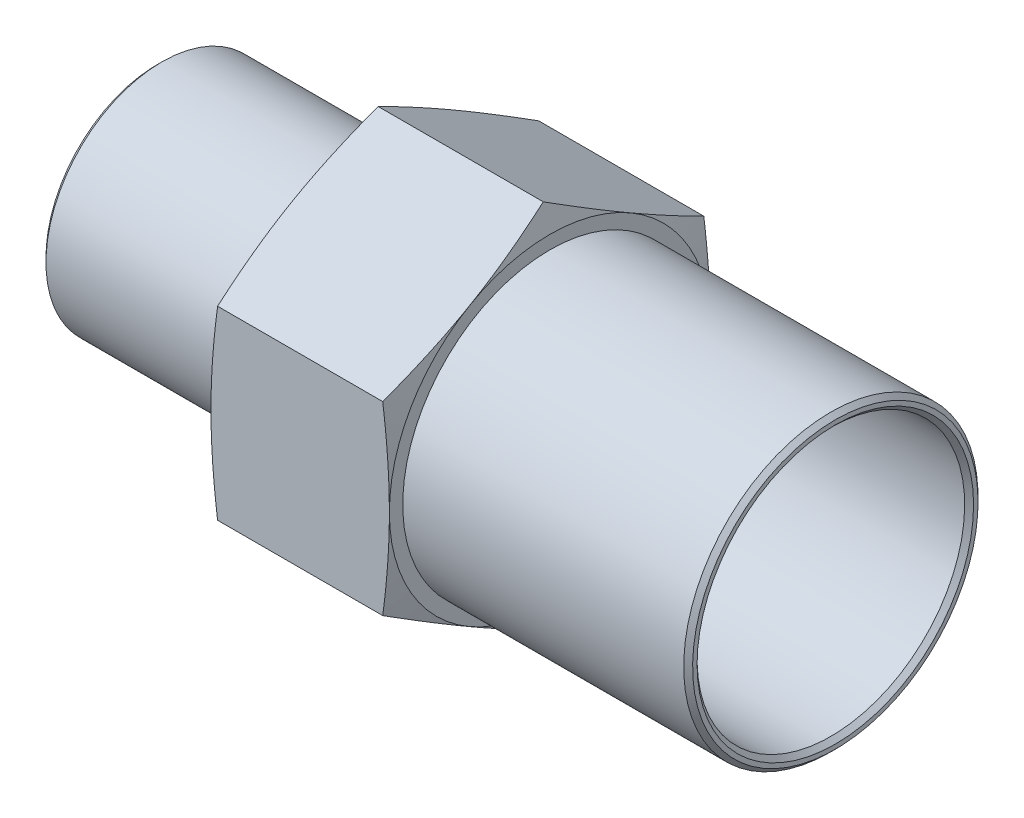
ISO-10303-21;
HEADER;
FILE_DESCRIPTION(('STEP AP214'),'2;1');
FILE_NAME('part.step','',(''),(''),'','','');
FILE_SCHEMA(('AUTOMOTIVE_DESIGN { 1 0 10303 214 1 1 1 1 }'));
ENDSEC;
DATA;
#1=APPLICATION_CONTEXT('core data for automotive mechanical design processes');
#2=APPLICATION_PROTOCOL_DEFINITION('international standard','automotive_design',2000,#1);
#3=PRODUCT_CONTEXT('',#1,'mechanical');
#4=PRODUCT('Part','Part','',(#3));
#5=PRODUCT_RELATED_PRODUCT_CATEGORY('part','',(#4));
#6=PRODUCT_DEFINITION_FORMATION('','',#4);
#7=PRODUCT_DEFINITION_CONTEXT('part definition',#1,'design');
#8=PRODUCT_DEFINITION('design','',#6,#7);
#9=PRODUCT_DEFINITION_SHAPE('','',#8);
#10=(LENGTH_UNIT() NAMED_UNIT(*) SI_UNIT(.MILLI.,.METRE.));
#11=(NAMED_UNIT(*) PLANE_ANGLE_UNIT() SI_UNIT($,.RADIAN.));
#12=(NAMED_UNIT(*) SI_UNIT($,.STERADIAN.) SOLID_ANGLE_UNIT());
#13=UNCERTAINTY_MEASURE_WITH_UNIT(LENGTH_MEASURE(1.E-05),#10,'distance_accuracy_value','');
#14=(GEOMETRIC_REPRESENTATION_CONTEXT(3) GLOBAL_UNCERTAINTY_ASSIGNED_CONTEXT((#13)) GLOBAL_UNIT_ASSIGNED_CONTEXT((#10,
#11,#12)) REPRESENTATION_CONTEXT('',''));
#15=CARTESIAN_POINT('',(0.,0.,0.));
#16=DIRECTION('',(0.,0.,1.));
#17=DIRECTION('',(1.,0.,0.));
#18=AXIS2_PLACEMENT_3D('',#15,#16,#17);
#19=CARTESIAN_POINT('',(22.35,0.,0.));
#20=DIRECTION('',(-1.,0.,0.));
#21=DIRECTION('',(0.,-1.,0.));
#22=AXIS2_PLACEMENT_3D('',#19,#20,#21);
#23=CYLINDRICAL_SURFACE('',#22,8.25);
#24=CARTESIAN_POINT('',(6.35,0.,0.));
#25=DIRECTION('',(1.,0.,0.));
#26=DIRECTION('',(0.,1.,0.));
#27=AXIS2_PLACEMENT_3D('',#24,#25,#26);
#28=CIRCLE('',#27,8.25);
#29=CARTESIAN_POINT('',(6.35,8.25,0.));
#30=VERTEX_POINT('',#29);
#31=EDGE_CURVE('E378',#30,#30,#28,.T.);
#32=ORIENTED_EDGE('',*,*,#31,.T.);
#33=EDGE_LOOP('',(#32));
#34=FACE_BOUND('',#33,.T.);
#35=CARTESIAN_POINT('',(22.1,0.,0.));
#36=DIRECTION('',(-1.,0.,0.));
#37=DIRECTION('',(0.,-1.,0.));
#38=AXIS2_PLACEMENT_3D('',#35,#36,#37);
#39=CIRCLE('',#38,8.25);
#40=CARTESIAN_POINT('',(22.1,-8.25,0.));
#41=VERTEX_POINT('',#40);
#42=EDGE_CURVE('E49',#41,#41,#39,.F.);
#43=ORIENTED_EDGE('',*,*,#42,.F.);
#44=EDGE_LOOP('',(#43));
#45=FACE_BOUND('',#44,.T.);
#46=ADVANCED_FACE('F45',(#34,#45),#23,.T.);
#47=CARTESIAN_POINT('',(-3.65,0.,0.));
#48=DIRECTION('',(-1.,0.,0.));
#49=DIRECTION('',(0.,-1.,0.));
#50=AXIS2_PLACEMENT_3D('',#47,#48,#49);
#51=CYLINDRICAL_SURFACE('',#50,6.5);
#52=CARTESIAN_POINT('',(-3.65,0.,0.));
#53=DIRECTION('',(-1.,0.,0.));
#54=DIRECTION('',(0.,-1.,0.));
#55=AXIS2_PLACEMENT_3D('',#52,#53,#54);
#56=CIRCLE('',#55,6.5);
#57=CARTESIAN_POINT('',(-3.65,-6.5,0.));
#58=VERTEX_POINT('',#57);
#59=EDGE_CURVE('E341',#58,#58,#56,.T.);
#60=ORIENTED_EDGE('',*,*,#59,.T.);
#61=EDGE_LOOP('',(#60));
#62=FACE_BOUND('',#61,.T.);
#63=CARTESIAN_POINT('',(-15.4,0.,0.));
#64=DIRECTION('',(1.,0.,0.));
#65=DIRECTION('',(0.,1.,0.));
#66=AXIS2_PLACEMENT_3D('',#63,#64,#65);
#67=CIRCLE('',#66,6.5);
#68=CARTESIAN_POINT('',(-15.4,6.5,0.));
#69=VERTEX_POINT('',#68);
#70=EDGE_CURVE('E330',#69,#69,#67,.T.);
#71=ORIENTED_EDGE('',*,*,#70,.T.);
#72=EDGE_LOOP('',(#71));
#73=FACE_BOUND('',#72,.T.);
#74=ADVANCED_FACE('F511',(#62,#73),#51,.T.);
#75=CARTESIAN_POINT('',(-3.65,-4.5,0.));
#76=DIRECTION('',(-1.,0.,0.));
#77=DIRECTION('',(0.,1.,0.));
#78=AXIS2_PLACEMENT_3D('',#75,#76,#77);
#79=PLANE('',#78);
#80=CARTESIAN_POINT('',(-3.65,0.,0.));
#81=DIRECTION('',(1.,0.,0.));
#82=DIRECTION('',(0.,-1.,0.));
#83=AXIS2_PLACEMENT_3D('',#80,#81,#82);
#84=CIRCLE('',#83,9.);
#85=CARTESIAN_POINT('',(-3.65,-7.79422863405995,4.5));
#86=VERTEX_POINT('',#85);
#87=CARTESIAN_POINT('',(-3.65,-7.79422863405995,-4.5));
#88=VERTEX_POINT('',#87);
#89=EDGE_CURVE('E298',#86,#88,#84,.T.);
#90=ORIENTED_EDGE('',*,*,#89,.F.);
#91=CARTESIAN_POINT('',(-3.65,0.,0.));
#92=DIRECTION('',(1.,0.,0.));
#93=DIRECTION('',(0.,-1.,0.));
#94=AXIS2_PLACEMENT_3D('',#91,#92,#93);
#95=CIRCLE('',#94,9.);
#96=CARTESIAN_POINT('',(-3.65,0.,9.));
#97=VERTEX_POINT('',#96);
#98=EDGE_CURVE('E235',#97,#86,#95,.T.);
#99=ORIENTED_EDGE('',*,*,#98,.F.);
#100=CARTESIAN_POINT('',(-3.65,0.,0.));
#101=DIRECTION('',(1.,0.,0.));
#102=DIRECTION('',(0.,-1.,0.));
#103=AXIS2_PLACEMENT_3D('',#100,#101,#102);
#104=CIRCLE('',#103,9.);
#105=CARTESIAN_POINT('',(-3.65,7.79422863405995,4.5));
#106=VERTEX_POINT('',#105);
#107=EDGE_CURVE('E227',#106,#97,#104,.T.);
#108=ORIENTED_EDGE('',*,*,#107,.F.);
#109=CARTESIAN_POINT('',(-3.65,0.,0.));
#110=DIRECTION('',(1.,0.,0.));
#111=DIRECTION('',(0.,-1.,0.));
#112=AXIS2_PLACEMENT_3D('',#109,#110,#111);
#113=CIRCLE('',#112,9.);
#114=CARTESIAN_POINT('',(-3.65,7.79422863405994,-4.5));
#115=VERTEX_POINT('',#114);
#116=EDGE_CURVE('E234',#115,#106,#113,.T.);
#117=ORIENTED_EDGE('',*,*,#116,.F.);
#118=CARTESIAN_POINT('',(-3.65,0.,0.));
#119=DIRECTION('',(1.,0.,0.));
#120=DIRECTION('',(0.,-1.,0.));
#121=AXIS2_PLACEMENT_3D('',#118,#119,#120);
#122=CIRCLE('',#121,9.);
#123=CARTESIAN_POINT('',(-3.65,0.,-9.));
#124=VERTEX_POINT('',#123);
#125=EDGE_CURVE('E208',#124,#115,#122,.T.);
#126=ORIENTED_EDGE('',*,*,#125,.F.);
#127=CARTESIAN_POINT('',(-3.65,0.,0.));
#128=DIRECTION('',(1.,0.,0.));
#129=DIRECTION('',(0.,-1.,0.));
#130=AXIS2_PLACEMENT_3D('',#127,#128,#129);
#131=CIRCLE('',#130,9.);
#132=EDGE_CURVE('E203',#88,#124,#131,.T.);
#133=ORIENTED_EDGE('',*,*,#132,.F.);
#134=EDGE_LOOP('',(#90,#99,#108,#117,#126,#133));
#135=FACE_BOUND('',#134,.T.);
#136=ORIENTED_EDGE('',*,*,#59,.F.);
#137=EDGE_LOOP('',(#136));
#138=FACE_BOUND('',#137,.T.);
#139=ADVANCED_FACE('F494',(#135,#138),#79,.T.);
#140=CARTESIAN_POINT('',(-4.65,-7.79422863405995,-4.5));
#141=DIRECTION('',(0.,-0.866025403784439,-0.5));
#142=DIRECTION('',(0.,0.5,-0.866025403784439));
#143=AXIS2_PLACEMENT_3D('',#140,#141,#142);
#144=PLANE('',#143);
#145=DIRECTION('',(1.,0.,0.));
#146=VECTOR('',#145,1.);
#147=CARTESIAN_POINT('',(-4.65,-5.19615242270663,-9.));
#148=LINE('',#147,#146);
#149=CARTESIAN_POINT('',(-3.27693304105358,-5.19615242270663,-9.));
#150=VERTEX_POINT('',#149);
#151=CARTESIAN_POINT('',(5.97693304105358,-5.19615242270663,-9.));
#152=VERTEX_POINT('',#151);
#153=EDGE_CURVE('E12',#150,#152,#148,.T.);
#154=ORIENTED_EDGE('',*,*,#153,.T.);
#155=CARTESIAN_POINT('',(5.97621087655858,-5.19345831548124,-9.00466633059542));
#156=CARTESIAN_POINT('',(6.35,-6.58737465792135,-6.59033240398856));
#157=CARTESIAN_POINT('',(6.35,-7.79422863405995,-4.5));
#158=CARTESIAN_POINT('',(6.35,-9.00108261019855,-2.40966759601143));
#159=CARTESIAN_POINT('',(5.97621087655858,-10.3949989526387,0.00466633059542202));
#160=(BOUNDED_CURVE() B_SPLINE_CURVE(2,(#155,#156,#157,#158,#159),.UNSPECIFIED.,.F.,
.F.) B_SPLINE_CURVE_WITH_KNOTS((3,2,3),(0.,5.21793533208069,10.4358706641614),
.UNSPECIFIED.) CURVE() GEOMETRIC_REPRESENTATION_ITEM() RATIONAL_B_SPLINE_CURVE((1.,
1.03802697460133,1.,1.03802697460135,1.)) REPRESENTATION_ITEM(''));
#161=CARTESIAN_POINT('',(6.35,-7.79422863405995,-4.5));
#162=VERTEX_POINT('',#161);
#163=EDGE_CURVE('E179',#152,#162,#160,.T.);
#164=ORIENTED_EDGE('',*,*,#163,.T.);
#165=CARTESIAN_POINT('',(5.97621087655858,-5.19345831548124,-9.00466633059542));
#166=CARTESIAN_POINT('',(6.35,-6.58737465792135,-6.59033240398856));
#167=CARTESIAN_POINT('',(6.35,-7.79422863405995,-4.5));
#168=CARTESIAN_POINT('',(6.35,-9.00108261019855,-2.40966759601143));
#169=CARTESIAN_POINT('',(5.97621087655858,-10.3949989526387,0.00466633059542202));
#170=(BOUNDED_CURVE() B_SPLINE_CURVE(2,(#165,#166,#167,#168,#169),.UNSPECIFIED.,.F.,
.F.) B_SPLINE_CURVE_WITH_KNOTS((3,2,3),(0.,5.21793533208069,10.4358706641614),
.UNSPECIFIED.) CURVE() GEOMETRIC_REPRESENTATION_ITEM() RATIONAL_B_SPLINE_CURVE((1.,
1.03802697460133,1.,1.03802697460135,1.)) REPRESENTATION_ITEM(''));
#171=CARTESIAN_POINT('',(5.97693304105358,-10.3923048454133,0.));
#172=VERTEX_POINT('',#171);
#173=EDGE_CURVE('E192',#162,#172,#170,.T.);
#174=ORIENTED_EDGE('',*,*,#173,.T.);
#175=DIRECTION('',(1.,0.,0.));
#176=VECTOR('',#175,1.);
#177=CARTESIAN_POINT('',(-4.65,-10.3923048454133,0.));
#178=LINE('',#177,#176);
#179=CARTESIAN_POINT('',(-3.27693304105358,-10.3923048454133,0.));
#180=VERTEX_POINT('',#179);
#181=EDGE_CURVE('E64',#180,#172,#178,.T.);
#182=ORIENTED_EDGE('',*,*,#181,.F.);
#183=CARTESIAN_POINT('',(-3.27621087655858,-5.19345831548124,-9.00466633059542));
#184=CARTESIAN_POINT('',(-3.65,-6.58737465792135,-6.59033240398856));
#185=CARTESIAN_POINT('',(-3.65,-7.79422863405995,-4.5));
#186=CARTESIAN_POINT('',(-3.65,-9.00108261019855,-2.40966759601143));
#187=CARTESIAN_POINT('',(-3.27621087655858,-10.3949989526387,0.00466633059542202));
#188=(BOUNDED_CURVE() B_SPLINE_CURVE(2,(#183,#184,#185,#186,#187),.UNSPECIFIED.,.F.,
.F.) B_SPLINE_CURVE_WITH_KNOTS((3,2,3),(0.,5.21793533208069,10.4358706641614),
.UNSPECIFIED.) CURVE() GEOMETRIC_REPRESENTATION_ITEM() RATIONAL_B_SPLINE_CURVE((1.,
1.03802697460133,1.,1.03802697460135,1.)) REPRESENTATION_ITEM(''));
#189=EDGE_CURVE('E97',#88,#180,#188,.T.);
#190=ORIENTED_EDGE('',*,*,#189,.F.);
#191=CARTESIAN_POINT('',(-3.27621087655858,-5.19345831548124,-9.00466633059542));
#192=CARTESIAN_POINT('',(-3.65,-6.58737465792135,-6.59033240398856));
#193=CARTESIAN_POINT('',(-3.65,-7.79422863405995,-4.5));
#194=CARTESIAN_POINT('',(-3.65,-9.00108261019855,-2.40966759601143));
#195=CARTESIAN_POINT('',(-3.27621087655858,-10.3949989526387,0.00466633059542202));
#196=(BOUNDED_CURVE() B_SPLINE_CURVE(2,(#191,#192,#193,#194,#195),.UNSPECIFIED.,.F.,
.F.) B_SPLINE_CURVE_WITH_KNOTS((3,2,3),(0.,5.21793533208069,10.4358706641614),
.UNSPECIFIED.) CURVE() GEOMETRIC_REPRESENTATION_ITEM() RATIONAL_B_SPLINE_CURVE((1.,
1.03802697460133,1.,1.03802697460135,1.)) REPRESENTATION_ITEM(''));
#197=EDGE_CURVE('E236',#150,#88,#196,.T.);
#198=ORIENTED_EDGE('',*,*,#197,.F.);
#199=EDGE_LOOP('',(#154,#164,#174,#182,#190,#198));
#200=FACE_BOUND('',#199,.T.);
#201=ADVANCED_FACE('F485',(#200),#144,.T.);
#202=CARTESIAN_POINT('',(-4.65,0.,-9.));
#203=DIRECTION('',(0.,0.,-1.));
#204=DIRECTION('',(0.,1.,0.));
#205=AXIS2_PLACEMENT_3D('',#202,#203,#204);
#206=PLANE('',#205);
#207=DIRECTION('',(1.,0.,0.));
#208=VECTOR('',#207,1.);
#209=CARTESIAN_POINT('',(-4.65,5.19615242270663,-9.));
#210=LINE('',#209,#208);
#211=CARTESIAN_POINT('',(-3.27693304105358,5.19615242270663,-9.));
#212=VERTEX_POINT('',#211);
#213=CARTESIAN_POINT('',(5.97693304105358,5.19615242270663,-9.));
#214=VERTEX_POINT('',#213);
#215=EDGE_CURVE('E56',#212,#214,#210,.T.);
#216=ORIENTED_EDGE('',*,*,#215,.T.);
#217=CARTESIAN_POINT('',(5.97621087655858,5.20154063715742,-9.));
#218=CARTESIAN_POINT('',(6.35,2.41370795227722,-9.));
#219=CARTESIAN_POINT('',(6.35,0.,-9.));
#220=CARTESIAN_POINT('',(6.35,-2.41370795227722,-9.));
#221=CARTESIAN_POINT('',(5.97621087655858,-5.20154063715742,-9.));
#222=(BOUNDED_CURVE() B_SPLINE_CURVE(2,(#217,#218,#219,#220,#221),.UNSPECIFIED.,.F.,
.F.) B_SPLINE_CURVE_WITH_KNOTS((3,2,3),(0.,5.21793533208069,10.4358706641614),
.UNSPECIFIED.) CURVE() GEOMETRIC_REPRESENTATION_ITEM() RATIONAL_B_SPLINE_CURVE((1.,
1.03802697460135,1.,1.03802697460135,1.)) REPRESENTATION_ITEM(''));
#223=CARTESIAN_POINT('',(6.35,0.,-9.));
#224=VERTEX_POINT('',#223);
#225=EDGE_CURVE('E154',#214,#224,#222,.T.);
#226=ORIENTED_EDGE('',*,*,#225,.T.);
#227=CARTESIAN_POINT('',(5.97621087655858,5.20154063715742,-9.));
#228=CARTESIAN_POINT('',(6.35,2.41370795227722,-9.));
#229=CARTESIAN_POINT('',(6.35,0.,-9.));
#230=CARTESIAN_POINT('',(6.35,-2.41370795227722,-9.));
#231=CARTESIAN_POINT('',(5.97621087655858,-5.20154063715742,-9.));
#232=(BOUNDED_CURVE() B_SPLINE_CURVE(2,(#227,#228,#229,#230,#231),.UNSPECIFIED.,.F.,
.F.) B_SPLINE_CURVE_WITH_KNOTS((3,2,3),(0.,5.21793533208069,10.4358706641614),
.UNSPECIFIED.) CURVE() GEOMETRIC_REPRESENTATION_ITEM() RATIONAL_B_SPLINE_CURVE((1.,
1.03802697460135,1.,1.03802697460135,1.)) REPRESENTATION_ITEM(''));
#233=EDGE_CURVE('E176',#224,#152,#232,.T.);
#234=ORIENTED_EDGE('',*,*,#233,.T.);
#235=ORIENTED_EDGE('',*,*,#153,.F.);
#236=CARTESIAN_POINT('',(-3.27621087655858,5.20154063715742,-9.));
#237=CARTESIAN_POINT('',(-3.65,2.41370795227722,-9.));
#238=CARTESIAN_POINT('',(-3.65,0.,-9.));
#239=CARTESIAN_POINT('',(-3.65,-2.41370795227722,-9.));
#240=CARTESIAN_POINT('',(-3.27621087655858,-5.20154063715742,-9.));
#241=(BOUNDED_CURVE() B_SPLINE_CURVE(2,(#236,#237,#238,#239,#240),.UNSPECIFIED.,.F.,
.F.) B_SPLINE_CURVE_WITH_KNOTS((3,2,3),(0.,5.21793533208069,10.4358706641614),
.UNSPECIFIED.) CURVE() GEOMETRIC_REPRESENTATION_ITEM() RATIONAL_B_SPLINE_CURVE((1.,
1.03802697460135,1.,1.03802697460135,1.)) REPRESENTATION_ITEM(''));
#242=EDGE_CURVE('E112',#124,#150,#241,.T.);
#243=ORIENTED_EDGE('',*,*,#242,.F.);
#244=CARTESIAN_POINT('',(-3.27621087655858,5.20154063715742,-9.));
#245=CARTESIAN_POINT('',(-3.65,2.41370795227722,-9.));
#246=CARTESIAN_POINT('',(-3.65,0.,-9.));
#247=CARTESIAN_POINT('',(-3.65,-2.41370795227722,-9.));
#248=CARTESIAN_POINT('',(-3.27621087655858,-5.20154063715742,-9.));
#249=(BOUNDED_CURVE() B_SPLINE_CURVE(2,(#244,#245,#246,#247,#248),.UNSPECIFIED.,.F.,
.F.) B_SPLINE_CURVE_WITH_KNOTS((3,2,3),(0.,5.21793533208069,10.4358706641614),
.UNSPECIFIED.) CURVE() GEOMETRIC_REPRESENTATION_ITEM() RATIONAL_B_SPLINE_CURVE((1.,
1.03802697460135,1.,1.03802697460135,1.)) REPRESENTATION_ITEM(''));
#250=EDGE_CURVE('E266',#212,#124,#249,.T.);
#251=ORIENTED_EDGE('',*,*,#250,.F.);
#252=EDGE_LOOP('',(#216,#226,#234,#235,#243,#251));
#253=FACE_BOUND('',#252,.T.);
#254=ADVANCED_FACE('F47',(#253),#206,.T.);
#255=CARTESIAN_POINT('',(-4.65,7.79422863405995,-4.5));
#256=DIRECTION('',(0.,0.866025403784439,-0.5));
#257=DIRECTION('',(0.,0.5,0.866025403784439));
#258=AXIS2_PLACEMENT_3D('',#255,#256,#257);
#259=PLANE('',#258);
#260=DIRECTION('',(1.,0.,0.));
#261=VECTOR('',#260,1.);
#262=CARTESIAN_POINT('',(-4.65,10.3923048454133,0.));
#263=LINE('',#262,#261);
#264=CARTESIAN_POINT('',(-3.27693304105358,10.3923048454133,0.));
#265=VERTEX_POINT('',#264);
#266=CARTESIAN_POINT('',(5.97693304105358,10.3923048454133,0.));
#267=VERTEX_POINT('',#266);
#268=EDGE_CURVE('E196',#265,#267,#263,.T.);
#269=ORIENTED_EDGE('',*,*,#268,.T.);
#270=CARTESIAN_POINT('',(5.97621087655858,10.3949989526387,0.00466633059542011));
#271=CARTESIAN_POINT('',(6.35,9.00108261019854,-2.40966759601143));
#272=CARTESIAN_POINT('',(6.35,7.79422863405994,-4.5));
#273=CARTESIAN_POINT('',(6.35,6.58737465792135,-6.59033240398858));
#274=CARTESIAN_POINT('',(5.97621087655858,5.19345831548123,-9.00466633059543));
#275=(BOUNDED_CURVE() B_SPLINE_CURVE(2,(#270,#271,#272,#273,#274),.UNSPECIFIED.,.F.,
.F.) B_SPLINE_CURVE_WITH_KNOTS((3,2,3),(0.,5.21793533208069,10.4358706641614),
.UNSPECIFIED.) CURVE() GEOMETRIC_REPRESENTATION_ITEM() RATIONAL_B_SPLINE_CURVE((1.,
1.03802697460135,1.,1.03802697460134,1.)) REPRESENTATION_ITEM(''));
#276=CARTESIAN_POINT('',(6.35,7.79422863405994,-4.5));
#277=VERTEX_POINT('',#276);
#278=EDGE_CURVE('E382',#267,#277,#275,.T.);
#279=ORIENTED_EDGE('',*,*,#278,.T.);
#280=CARTESIAN_POINT('',(5.97621087655858,10.3949989526387,0.00466633059542011));
#281=CARTESIAN_POINT('',(6.35,9.00108261019854,-2.40966759601143));
#282=CARTESIAN_POINT('',(6.35,7.79422863405994,-4.5));
#283=CARTESIAN_POINT('',(6.35,6.58737465792135,-6.59033240398858));
#284=CARTESIAN_POINT('',(5.97621087655858,5.19345831548123,-9.00466633059543));
#285=(BOUNDED_CURVE() B_SPLINE_CURVE(2,(#280,#281,#282,#283,#284),.UNSPECIFIED.,.F.,
.F.) B_SPLINE_CURVE_WITH_KNOTS((3,2,3),(0.,5.21793533208069,10.4358706641614),
.UNSPECIFIED.) CURVE() GEOMETRIC_REPRESENTATION_ITEM() RATIONAL_B_SPLINE_CURVE((1.,
1.03802697460135,1.,1.03802697460134,1.)) REPRESENTATION_ITEM(''));
#286=EDGE_CURVE('E156',#277,#214,#285,.T.);
#287=ORIENTED_EDGE('',*,*,#286,.T.);
#288=ORIENTED_EDGE('',*,*,#215,.F.);
#289=CARTESIAN_POINT('',(-3.27621087655858,10.3949989526387,0.00466633059542011));
#290=CARTESIAN_POINT('',(-3.65,9.00108261019854,-2.40966759601143));
#291=CARTESIAN_POINT('',(-3.65,7.79422863405994,-4.5));
#292=CARTESIAN_POINT('',(-3.65000000000001,6.58737465792135,-6.59033240398858));
#293=CARTESIAN_POINT('',(-3.27621087655858,5.19345831548123,-9.00466633059543));
#294=(BOUNDED_CURVE() B_SPLINE_CURVE(2,(#289,#290,#291,#292,#293),.UNSPECIFIED.,.F.,
.F.) B_SPLINE_CURVE_WITH_KNOTS((3,2,3),(0.,5.21793533208069,10.4358706641614),
.UNSPECIFIED.) CURVE() GEOMETRIC_REPRESENTATION_ITEM() RATIONAL_B_SPLINE_CURVE((1.,
1.03802697460135,1.,1.03802697460134,1.)) REPRESENTATION_ITEM(''));
#295=EDGE_CURVE('E251',#115,#212,#294,.T.);
#296=ORIENTED_EDGE('',*,*,#295,.F.);
#297=CARTESIAN_POINT('',(-3.27621087655858,10.3949989526387,0.00466633059542011));
#298=CARTESIAN_POINT('',(-3.65,9.00108261019854,-2.40966759601143));
#299=CARTESIAN_POINT('',(-3.65,7.79422863405994,-4.5));
#300=CARTESIAN_POINT('',(-3.65000000000001,6.58737465792135,-6.59033240398858));
#301=CARTESIAN_POINT('',(-3.27621087655858,5.19345831548123,-9.00466633059543));
#302=(BOUNDED_CURVE() B_SPLINE_CURVE(2,(#297,#298,#299,#300,#301),.UNSPECIFIED.,.F.,
.F.) B_SPLINE_CURVE_WITH_KNOTS((3,2,3),(0.,5.21793533208069,10.4358706641614),
.UNSPECIFIED.) CURVE() GEOMETRIC_REPRESENTATION_ITEM() RATIONAL_B_SPLINE_CURVE((1.,
1.03802697460135,1.,1.03802697460134,1.)) REPRESENTATION_ITEM(''));
#303=EDGE_CURVE('E209',#265,#115,#302,.T.);
#304=ORIENTED_EDGE('',*,*,#303,.F.);
#305=EDGE_LOOP('',(#269,#279,#287,#288,#296,#304));
#306=FACE_BOUND('',#305,.T.);
#307=ADVANCED_FACE('F503',(#306),#259,.T.);
#308=CARTESIAN_POINT('',(-4.65,-7.79422863405995,4.5));
#309=DIRECTION('',(0.,-0.866025403784439,0.5));
#310=DIRECTION('',(0.,-0.5,-0.866025403784439));
#311=AXIS2_PLACEMENT_3D('',#308,#309,#310);
#312=PLANE('',#311);
#313=ORIENTED_EDGE('',*,*,#181,.T.);
#314=CARTESIAN_POINT('',(5.97621087655858,-10.3949989526387,-0.00466633059541821));
#315=CARTESIAN_POINT('',(6.35,-9.00108261019856,2.4096675960114));
#316=CARTESIAN_POINT('',(6.35,-7.79422863405995,4.5));
#317=CARTESIAN_POINT('',(6.35,-6.58737465792133,6.5903324039886));
#318=CARTESIAN_POINT('',(5.97621087655858,-5.19345831548124,9.00466633059542));
#319=(BOUNDED_CURVE() B_SPLINE_CURVE(2,(#314,#315,#316,#317,#318),.UNSPECIFIED.,.F.,
.F.) B_SPLINE_CURVE_WITH_KNOTS((3,2,3),(0.,5.21793533208069,10.4358706641614),
.UNSPECIFIED.) CURVE() GEOMETRIC_REPRESENTATION_ITEM() RATIONAL_B_SPLINE_CURVE((1.,
1.03802697460135,1.,1.03802697460134,1.)) REPRESENTATION_ITEM(''));
#320=CARTESIAN_POINT('',(6.35,-7.79422863405995,4.5));
#321=VERTEX_POINT('',#320);
#322=EDGE_CURVE('E305',#172,#321,#319,.T.);
#323=ORIENTED_EDGE('',*,*,#322,.T.);
#324=CARTESIAN_POINT('',(5.97621087655858,-10.3949989526387,-0.00466633059541821));
#325=CARTESIAN_POINT('',(6.35,-9.00108261019856,2.4096675960114));
#326=CARTESIAN_POINT('',(6.35,-7.79422863405995,4.5));
#327=CARTESIAN_POINT('',(6.35,-6.58737465792133,6.5903324039886));
#328=CARTESIAN_POINT('',(5.97621087655858,-5.19345831548124,9.00466633059542));
#329=(BOUNDED_CURVE() B_SPLINE_CURVE(2,(#324,#325,#326,#327,#328),.UNSPECIFIED.,.F.,
.F.) B_SPLINE_CURVE_WITH_KNOTS((3,2,3),(0.,5.21793533208069,10.4358706641614),
.UNSPECIFIED.) CURVE() GEOMETRIC_REPRESENTATION_ITEM() RATIONAL_B_SPLINE_CURVE((1.,
1.03802697460135,1.,1.03802697460134,1.)) REPRESENTATION_ITEM(''));
#330=CARTESIAN_POINT('',(5.97693304105358,-5.19615242270663,9.));
#331=VERTEX_POINT('',#330);
#332=EDGE_CURVE('E388',#321,#331,#329,.T.);
#333=ORIENTED_EDGE('',*,*,#332,.T.);
#334=DIRECTION('',(1.,0.,0.));
#335=VECTOR('',#334,1.);
#336=CARTESIAN_POINT('',(-4.65,-5.19615242270663,9.));
#337=LINE('',#336,#335);
#338=CARTESIAN_POINT('',(-3.27693304105358,-5.19615242270663,9.));
#339=VERTEX_POINT('',#338);
#340=EDGE_CURVE('E106',#339,#331,#337,.T.);
#341=ORIENTED_EDGE('',*,*,#340,.F.);
#342=CARTESIAN_POINT('',(-3.27621087655858,-10.3949989526387,-0.00466633059541821));
#343=CARTESIAN_POINT('',(-3.65,-9.00108261019856,2.4096675960114));
#344=CARTESIAN_POINT('',(-3.65,-7.79422863405995,4.5));
#345=CARTESIAN_POINT('',(-3.65,-6.58737465792133,6.5903324039886));
#346=CARTESIAN_POINT('',(-3.27621087655858,-5.19345831548124,9.00466633059542));
#347=(BOUNDED_CURVE() B_SPLINE_CURVE(2,(#342,#343,#344,#345,#346),.UNSPECIFIED.,.F.,
.F.) B_SPLINE_CURVE_WITH_KNOTS((3,2,3),(0.,5.21793533208069,10.4358706641614),
.UNSPECIFIED.) CURVE() GEOMETRIC_REPRESENTATION_ITEM() RATIONAL_B_SPLINE_CURVE((1.,
1.03802697460135,1.,1.03802697460134,1.)) REPRESENTATION_ITEM(''));
#348=EDGE_CURVE('E221',#86,#339,#347,.T.);
#349=ORIENTED_EDGE('',*,*,#348,.F.);
#350=CARTESIAN_POINT('',(-3.27621087655858,-10.3949989526387,-0.00466633059541821));
#351=CARTESIAN_POINT('',(-3.65,-9.00108261019856,2.4096675960114));
#352=CARTESIAN_POINT('',(-3.65,-7.79422863405995,4.5));
#353=CARTESIAN_POINT('',(-3.65,-6.58737465792133,6.5903324039886));
#354=CARTESIAN_POINT('',(-3.27621087655858,-5.19345831548124,9.00466633059542));
#355=(BOUNDED_CURVE() B_SPLINE_CURVE(2,(#350,#351,#352,#353,#354),.UNSPECIFIED.,.F.,
.F.) B_SPLINE_CURVE_WITH_KNOTS((3,2,3),(0.,5.21793533208069,10.4358706641614),
.UNSPECIFIED.) CURVE() GEOMETRIC_REPRESENTATION_ITEM() RATIONAL_B_SPLINE_CURVE((1.,
1.03802697460135,1.,1.03802697460134,1.)) REPRESENTATION_ITEM(''));
#356=EDGE_CURVE('E267',#180,#86,#355,.T.);
#357=ORIENTED_EDGE('',*,*,#356,.F.);
#358=EDGE_LOOP('',(#313,#323,#333,#341,#349,#357));
#359=FACE_BOUND('',#358,.T.);
#360=ADVANCED_FACE('F481',(#359),#312,.T.);
#361=CARTESIAN_POINT('',(-4.65,0.,9.));
#362=DIRECTION('',(0.,0.,1.));
#363=DIRECTION('',(0.,-1.,0.));
#364=AXIS2_PLACEMENT_3D('',#361,#362,#363);
#365=PLANE('',#364);
#366=ORIENTED_EDGE('',*,*,#340,.T.);
#367=CARTESIAN_POINT('',(5.97621087655858,-5.20154063715742,9.));
#368=CARTESIAN_POINT('',(6.35,-2.41370795227726,9.));
#369=CARTESIAN_POINT('',(6.35,0.,9.));
#370=CARTESIAN_POINT('',(6.35,2.41370795227727,8.99999999999999));
#371=CARTESIAN_POINT('',(5.97621087655858,5.20154063715742,9.));
#372=(BOUNDED_CURVE() B_SPLINE_CURVE(2,(#367,#368,#369,#370,#371),.UNSPECIFIED.,.F.,
.F.) B_SPLINE_CURVE_WITH_KNOTS((3,2,3),(0.,5.21793533208069,10.4358706641614),
.UNSPECIFIED.) CURVE() GEOMETRIC_REPRESENTATION_ITEM() RATIONAL_B_SPLINE_CURVE((1.,
1.03802697460134,1.,1.03802697460134,1.)) REPRESENTATION_ITEM(''));
#373=CARTESIAN_POINT('',(6.35,0.,9.));
#374=VERTEX_POINT('',#373);
#375=EDGE_CURVE('E173',#331,#374,#372,.T.);
#376=ORIENTED_EDGE('',*,*,#375,.T.);
#377=CARTESIAN_POINT('',(5.97621087655858,-5.20154063715742,9.));
#378=CARTESIAN_POINT('',(6.35,-2.41370795227726,9.));
#379=CARTESIAN_POINT('',(6.35,0.,9.));
#380=CARTESIAN_POINT('',(6.35,2.41370795227727,8.99999999999999));
#381=CARTESIAN_POINT('',(5.97621087655858,5.20154063715742,9.));
#382=(BOUNDED_CURVE() B_SPLINE_CURVE(2,(#377,#378,#379,#380,#381),.UNSPECIFIED.,.F.,
.F.) B_SPLINE_CURVE_WITH_KNOTS((3,2,3),(0.,5.21793533208069,10.4358706641614),
.UNSPECIFIED.) CURVE() GEOMETRIC_REPRESENTATION_ITEM() RATIONAL_B_SPLINE_CURVE((1.,
1.03802697460134,1.,1.03802697460134,1.)) REPRESENTATION_ITEM(''));
#383=CARTESIAN_POINT('',(5.97693304105358,5.19615242270664,9.));
#384=VERTEX_POINT('',#383);
#385=EDGE_CURVE('E387',#374,#384,#382,.T.);
#386=ORIENTED_EDGE('',*,*,#385,.T.);
#387=DIRECTION('',(1.,0.,0.));
#388=VECTOR('',#387,1.);
#389=CARTESIAN_POINT('',(-4.65,5.19615242270664,9.));
#390=LINE('',#389,#388);
#391=CARTESIAN_POINT('',(-3.27693304105358,5.19615242270664,9.));
#392=VERTEX_POINT('',#391);
#393=EDGE_CURVE('E202',#392,#384,#390,.T.);
#394=ORIENTED_EDGE('',*,*,#393,.F.);
#395=CARTESIAN_POINT('',(-3.27621087655858,-5.20154063715742,9.));
#396=CARTESIAN_POINT('',(-3.65,-2.41370795227726,9.));
#397=CARTESIAN_POINT('',(-3.65,0.,9.));
#398=CARTESIAN_POINT('',(-3.65,2.41370795227727,8.99999999999999));
#399=CARTESIAN_POINT('',(-3.27621087655858,5.20154063715742,9.));
#400=(BOUNDED_CURVE() B_SPLINE_CURVE(2,(#395,#396,#397,#398,#399),.UNSPECIFIED.,.F.,
.F.) B_SPLINE_CURVE_WITH_KNOTS((3,2,3),(0.,5.21793533208069,10.4358706641614),
.UNSPECIFIED.) CURVE() GEOMETRIC_REPRESENTATION_ITEM() RATIONAL_B_SPLINE_CURVE((1.,
1.03802697460134,1.,1.03802697460134,1.)) REPRESENTATION_ITEM(''));
#401=EDGE_CURVE('E92',#97,#392,#400,.T.);
#402=ORIENTED_EDGE('',*,*,#401,.F.);
#403=CARTESIAN_POINT('',(-3.27621087655858,-5.20154063715742,9.));
#404=CARTESIAN_POINT('',(-3.65,-2.41370795227726,9.));
#405=CARTESIAN_POINT('',(-3.65,0.,9.));
#406=CARTESIAN_POINT('',(-3.65,2.41370795227727,8.99999999999999));
#407=CARTESIAN_POINT('',(-3.27621087655858,5.20154063715742,9.));
#408=(BOUNDED_CURVE() B_SPLINE_CURVE(2,(#403,#404,#405,#406,#407),.UNSPECIFIED.,.F.,
.F.) B_SPLINE_CURVE_WITH_KNOTS((3,2,3),(0.,5.21793533208069,10.4358706641614),
.UNSPECIFIED.) CURVE() GEOMETRIC_REPRESENTATION_ITEM() RATIONAL_B_SPLINE_CURVE((1.,
1.03802697460134,1.,1.03802697460134,1.)) REPRESENTATION_ITEM(''));
#409=EDGE_CURVE('E207',#339,#97,#408,.T.);
#410=ORIENTED_EDGE('',*,*,#409,.F.);
#411=EDGE_LOOP('',(#366,#376,#386,#394,#402,#410));
#412=FACE_BOUND('',#411,.T.);
#413=ADVANCED_FACE('F476',(#412),#365,.T.);
#414=CARTESIAN_POINT('',(-4.65,7.79422863405995,4.5));
#415=DIRECTION('',(0.,0.866025403784439,0.5));
#416=DIRECTION('',(0.,-0.5,0.866025403784439));
#417=AXIS2_PLACEMENT_3D('',#414,#415,#416);
#418=PLANE('',#417);
#419=ORIENTED_EDGE('',*,*,#393,.T.);
#420=CARTESIAN_POINT('',(5.97621087655858,5.19345831548124,9.00466633059542));
#421=CARTESIAN_POINT('',(6.35,6.58737465792135,6.5903324039886));
#422=CARTESIAN_POINT('',(6.35,7.79422863405995,4.5));
#423=CARTESIAN_POINT('',(6.35,9.00108261019856,2.40966759601141));
#424=CARTESIAN_POINT('',(5.97621087655858,10.3949989526387,-0.00466633059542392));
#425=(BOUNDED_CURVE() B_SPLINE_CURVE(2,(#420,#421,#422,#423,#424),.UNSPECIFIED.,.F.,
.F.) B_SPLINE_CURVE_WITH_KNOTS((3,2,3),(0.,5.21793533208069,10.4358706641614),
.UNSPECIFIED.) CURVE() GEOMETRIC_REPRESENTATION_ITEM() RATIONAL_B_SPLINE_CURVE((1.,
1.03802697460137,1.,1.03802697460134,1.)) REPRESENTATION_ITEM(''));
#426=CARTESIAN_POINT('',(6.35,7.79422863405995,4.5));
#427=VERTEX_POINT('',#426);
#428=EDGE_CURVE('E396',#384,#427,#425,.T.);
#429=ORIENTED_EDGE('',*,*,#428,.T.);
#430=CARTESIAN_POINT('',(5.97621087655858,5.19345831548124,9.00466633059542));
#431=CARTESIAN_POINT('',(6.35,6.58737465792135,6.5903324039886));
#432=CARTESIAN_POINT('',(6.35,7.79422863405995,4.5));
#433=CARTESIAN_POINT('',(6.35,9.00108261019856,2.40966759601141));
#434=CARTESIAN_POINT('',(5.97621087655858,10.3949989526387,-0.00466633059542392));
#435=(BOUNDED_CURVE() B_SPLINE_CURVE(2,(#430,#431,#432,#433,#434),.UNSPECIFIED.,.F.,
.F.) B_SPLINE_CURVE_WITH_KNOTS((3,2,3),(0.,5.21793533208069,10.4358706641614),
.UNSPECIFIED.) CURVE() GEOMETRIC_REPRESENTATION_ITEM() RATIONAL_B_SPLINE_CURVE((1.,
1.03802697460137,1.,1.03802697460134,1.)) REPRESENTATION_ITEM(''));
#436=EDGE_CURVE('E186',#427,#267,#435,.T.);
#437=ORIENTED_EDGE('',*,*,#436,.T.);
#438=ORIENTED_EDGE('',*,*,#268,.F.);
#439=CARTESIAN_POINT('',(-3.27621087655858,5.19345831548124,9.00466633059542));
#440=CARTESIAN_POINT('',(-3.65,6.58737465792135,6.5903324039886));
#441=CARTESIAN_POINT('',(-3.65,7.79422863405995,4.5));
#442=CARTESIAN_POINT('',(-3.65,9.00108261019856,2.40966759601141));
#443=CARTESIAN_POINT('',(-3.27621087655858,10.3949989526387,-0.00466633059542392));
#444=(BOUNDED_CURVE() B_SPLINE_CURVE(2,(#439,#440,#441,#442,#443),.UNSPECIFIED.,.F.,
.F.) B_SPLINE_CURVE_WITH_KNOTS((3,2,3),(0.,5.21793533208069,10.4358706641614),
.UNSPECIFIED.) CURVE() GEOMETRIC_REPRESENTATION_ITEM() RATIONAL_B_SPLINE_CURVE((1.,
1.03802697460137,1.,1.03802697460134,1.)) REPRESENTATION_ITEM(''));
#445=EDGE_CURVE('E215',#106,#265,#444,.T.);
#446=ORIENTED_EDGE('',*,*,#445,.F.);
#447=CARTESIAN_POINT('',(-3.27621087655858,5.19345831548124,9.00466633059542));
#448=CARTESIAN_POINT('',(-3.65,6.58737465792135,6.5903324039886));
#449=CARTESIAN_POINT('',(-3.65,7.79422863405995,4.5));
#450=CARTESIAN_POINT('',(-3.65,9.00108261019856,2.40966759601141));
#451=CARTESIAN_POINT('',(-3.27621087655858,10.3949989526387,-0.00466633059542392));
#452=(BOUNDED_CURVE() B_SPLINE_CURVE(2,(#447,#448,#449,#450,#451),.UNSPECIFIED.,.F.,
.F.) B_SPLINE_CURVE_WITH_KNOTS((3,2,3),(0.,5.21793533208069,10.4358706641614),
.UNSPECIFIED.) CURVE() GEOMETRIC_REPRESENTATION_ITEM() RATIONAL_B_SPLINE_CURVE((1.,
1.03802697460137,1.,1.03802697460134,1.)) REPRESENTATION_ITEM(''));
#453=EDGE_CURVE('E226',#392,#106,#452,.T.);
#454=ORIENTED_EDGE('',*,*,#453,.F.);
#455=EDGE_LOOP('',(#419,#429,#437,#438,#446,#454));
#456=FACE_BOUND('',#455,.T.);
#457=ADVANCED_FACE('F468',(#456),#418,.T.);
#458=CARTESIAN_POINT('',(-10.35,0.,0.));
#459=DIRECTION('',(1.,0.,0.));
#460=DIRECTION('',(0.,1.,0.));
#461=AXIS2_PLACEMENT_3D('',#458,#459,#460);
#462=CYLINDRICAL_SURFACE('',#461,5.75);
#463=CARTESIAN_POINT('',(-15.4,0.,0.));
#464=DIRECTION('',(-1.,0.,0.));
#465=DIRECTION('',(0.,-1.,0.));
#466=AXIS2_PLACEMENT_3D('',#463,#464,#465);
#467=CIRCLE('',#466,5.75);
#468=CARTESIAN_POINT('',(-15.4,-5.75,0.));
#469=VERTEX_POINT('',#468);
#470=EDGE_CURVE('E337',#469,#469,#467,.T.);
#471=ORIENTED_EDGE('',*,*,#470,.T.);
#472=EDGE_LOOP('',(#471));
#473=FACE_BOUND('',#472,.T.);
#474=CARTESIAN_POINT('',(4.6,0.,0.));
#475=DIRECTION('',(1.,0.,0.));
#476=DIRECTION('',(0.,1.,0.));
#477=AXIS2_PLACEMENT_3D('',#474,#475,#476);
#478=CIRCLE('',#477,5.75);
#479=CARTESIAN_POINT('',(4.6,5.75,0.));
#480=VERTEX_POINT('',#479);
#481=EDGE_CURVE('E374',#480,#480,#478,.T.);
#482=ORIENTED_EDGE('',*,*,#481,.T.);
#483=EDGE_LOOP('',(#482));
#484=FACE_BOUND('',#483,.T.);
#485=ADVANCED_FACE('F550',(#473,#484),#462,.F.);
#486=CARTESIAN_POINT('',(-3.46310543827929,0.,0.));
#487=DIRECTION('',(1.,0.,0.));
#488=DIRECTION('',(0.,-1.,0.));
#489=AXIS2_PLACEMENT_3D('',#486,#487,#488);
#490=CONICAL_SURFACE('',#489,9.6975,1.30899693899575);
#491=ORIENTED_EDGE('',*,*,#189,.T.);
#492=ORIENTED_EDGE('',*,*,#356,.T.);
#493=ORIENTED_EDGE('',*,*,#89,.T.);
#494=EDGE_LOOP('',(#491,#492,#493));
#495=FACE_BOUND('',#494,.T.);
#496=ADVANCED_FACE('F553',(#495),#490,.T.);
#497=CARTESIAN_POINT('',(-3.46310543827929,0.,0.));
#498=DIRECTION('',(1.,0.,0.));
#499=DIRECTION('',(0.,-1.,0.));
#500=AXIS2_PLACEMENT_3D('',#497,#498,#499);
#501=CONICAL_SURFACE('',#500,9.6975,1.30899693899575);
#502=ORIENTED_EDGE('',*,*,#242,.T.);
#503=ORIENTED_EDGE('',*,*,#197,.T.);
#504=ORIENTED_EDGE('',*,*,#132,.T.);
#505=EDGE_LOOP('',(#502,#503,#504));
#506=FACE_BOUND('',#505,.T.);
#507=ADVANCED_FACE('F489',(#506),#501,.T.);
#508=CARTESIAN_POINT('',(-3.46310543827929,0.,0.));
#509=DIRECTION('',(1.,0.,0.));
#510=DIRECTION('',(0.,-1.,0.));
#511=AXIS2_PLACEMENT_3D('',#508,#509,#510);
#512=CONICAL_SURFACE('',#511,9.6975,1.30899693899575);
#513=ORIENTED_EDGE('',*,*,#295,.T.);
#514=ORIENTED_EDGE('',*,*,#250,.T.);
#515=ORIENTED_EDGE('',*,*,#125,.T.);
#516=EDGE_LOOP('',(#513,#514,#515));
#517=FACE_BOUND('',#516,.T.);
#518=ADVANCED_FACE('F498',(#517),#512,.T.);
#519=CARTESIAN_POINT('',(-3.46310543827929,0.,0.));
#520=DIRECTION('',(1.,0.,0.));
#521=DIRECTION('',(0.,-1.,0.));
#522=AXIS2_PLACEMENT_3D('',#519,#520,#521);
#523=CONICAL_SURFACE('',#522,9.6975,1.30899693899575);
#524=ORIENTED_EDGE('',*,*,#303,.T.);
#525=ORIENTED_EDGE('',*,*,#116,.T.);
#526=ORIENTED_EDGE('',*,*,#445,.T.);
#527=EDGE_LOOP('',(#524,#525,#526));
#528=FACE_BOUND('',#527,.T.);
#529=ADVANCED_FACE('F502',(#528),#523,.T.);
#530=CARTESIAN_POINT('',(-3.46310543827929,0.,0.));
#531=DIRECTION('',(1.,0.,0.));
#532=DIRECTION('',(0.,-1.,0.));
#533=AXIS2_PLACEMENT_3D('',#530,#531,#532);
#534=CONICAL_SURFACE('',#533,9.6975,1.30899693899575);
#535=ORIENTED_EDGE('',*,*,#453,.T.);
#536=ORIENTED_EDGE('',*,*,#107,.T.);
#537=ORIENTED_EDGE('',*,*,#401,.T.);
#538=EDGE_LOOP('',(#535,#536,#537));
#539=FACE_BOUND('',#538,.T.);
#540=ADVANCED_FACE('F555',(#539),#534,.T.);
#541=CARTESIAN_POINT('',(-3.46310543827929,0.,0.));
#542=DIRECTION('',(1.,0.,0.));
#543=DIRECTION('',(0.,-1.,0.));
#544=AXIS2_PLACEMENT_3D('',#541,#542,#543);
#545=CONICAL_SURFACE('',#544,9.6975,1.30899693899575);
#546=ORIENTED_EDGE('',*,*,#409,.T.);
#547=ORIENTED_EDGE('',*,*,#98,.T.);
#548=ORIENTED_EDGE('',*,*,#348,.T.);
#549=EDGE_LOOP('',(#546,#547,#548));
#550=FACE_BOUND('',#549,.T.);
#551=ADVANCED_FACE('F542',(#550),#545,.T.);
#552=CARTESIAN_POINT('',(6.16310543827929,0.,0.));
#553=DIRECTION('',(-1.,0.,0.));
#554=DIRECTION('',(0.,-1.,0.));
#555=AXIS2_PLACEMENT_3D('',#552,#553,#554);
#556=CONICAL_SURFACE('',#555,9.6975,1.30899693899575);
#557=ORIENTED_EDGE('',*,*,#173,.F.);
#558=CARTESIAN_POINT('',(6.35,0.,0.));
#559=DIRECTION('',(1.,0.,0.));
#560=DIRECTION('',(0.,-1.,0.));
#561=AXIS2_PLACEMENT_3D('',#558,#559,#560);
#562=CIRCLE('',#561,9.);
#563=EDGE_CURVE('E168',#321,#162,#562,.T.);
#564=ORIENTED_EDGE('',*,*,#563,.F.);
#565=ORIENTED_EDGE('',*,*,#322,.F.);
#566=EDGE_LOOP('',(#557,#564,#565));
#567=FACE_BOUND('',#566,.T.);
#568=ADVANCED_FACE('F484',(#567),#556,.T.);
#569=CARTESIAN_POINT('',(6.16310543827929,0.,0.));
#570=DIRECTION('',(-1.,0.,0.));
#571=DIRECTION('',(0.,-1.,0.));
#572=AXIS2_PLACEMENT_3D('',#569,#570,#571);
#573=CONICAL_SURFACE('',#572,9.6975,1.30899693899575);
#574=ORIENTED_EDGE('',*,*,#233,.F.);
#575=CARTESIAN_POINT('',(6.35,0.,0.));
#576=DIRECTION('',(1.,0.,0.));
#577=DIRECTION('',(0.,-1.,0.));
#578=AXIS2_PLACEMENT_3D('',#575,#576,#577);
#579=CIRCLE('',#578,9.);
#580=EDGE_CURVE('E161',#162,#224,#579,.T.);
#581=ORIENTED_EDGE('',*,*,#580,.F.);
#582=ORIENTED_EDGE('',*,*,#163,.F.);
#583=EDGE_LOOP('',(#574,#581,#582));
#584=FACE_BOUND('',#583,.T.);
#585=ADVANCED_FACE('F177',(#584),#573,.T.);
#586=CARTESIAN_POINT('',(6.16310543827929,0.,0.));
#587=DIRECTION('',(-1.,0.,0.));
#588=DIRECTION('',(0.,-1.,0.));
#589=AXIS2_PLACEMENT_3D('',#586,#587,#588);
#590=CONICAL_SURFACE('',#589,9.6975,1.30899693899575);
#591=ORIENTED_EDGE('',*,*,#286,.F.);
#592=CARTESIAN_POINT('',(6.35,0.,0.));
#593=DIRECTION('',(1.,0.,0.));
#594=DIRECTION('',(0.,-1.,0.));
#595=AXIS2_PLACEMENT_3D('',#592,#593,#594);
#596=CIRCLE('',#595,9.);
#597=EDGE_CURVE('E150',#224,#277,#596,.T.);
#598=ORIENTED_EDGE('',*,*,#597,.F.);
#599=ORIENTED_EDGE('',*,*,#225,.F.);
#600=EDGE_LOOP('',(#591,#598,#599));
#601=FACE_BOUND('',#600,.T.);
#602=ADVANCED_FACE('F152',(#601),#590,.T.);
#603=CARTESIAN_POINT('',(6.16310543827929,0.,0.));
#604=DIRECTION('',(-1.,0.,0.));
#605=DIRECTION('',(0.,-1.,0.));
#606=AXIS2_PLACEMENT_3D('',#603,#604,#605);
#607=CONICAL_SURFACE('',#606,9.6975,1.30899693899575);
#608=ORIENTED_EDGE('',*,*,#278,.F.);
#609=ORIENTED_EDGE('',*,*,#436,.F.);
#610=CARTESIAN_POINT('',(6.35,0.,0.));
#611=DIRECTION('',(1.,0.,0.));
#612=DIRECTION('',(0.,-1.,0.));
#613=AXIS2_PLACEMENT_3D('',#610,#611,#612);
#614=CIRCLE('',#613,9.);
#615=EDGE_CURVE('E162',#277,#427,#614,.T.);
#616=ORIENTED_EDGE('',*,*,#615,.F.);
#617=EDGE_LOOP('',(#608,#609,#616));
#618=FACE_BOUND('',#617,.T.);
#619=ADVANCED_FACE('F533',(#618),#607,.T.);
#620=CARTESIAN_POINT('',(6.16310543827929,0.,0.));
#621=DIRECTION('',(-1.,0.,0.));
#622=DIRECTION('',(0.,-1.,0.));
#623=AXIS2_PLACEMENT_3D('',#620,#621,#622);
#624=CONICAL_SURFACE('',#623,9.6975,1.30899693899575);
#625=ORIENTED_EDGE('',*,*,#428,.F.);
#626=ORIENTED_EDGE('',*,*,#385,.F.);
#627=CARTESIAN_POINT('',(6.35,0.,0.));
#628=DIRECTION('',(1.,0.,0.));
#629=DIRECTION('',(0.,-1.,0.));
#630=AXIS2_PLACEMENT_3D('',#627,#628,#629);
#631=CIRCLE('',#630,9.);
#632=EDGE_CURVE('E397',#427,#374,#631,.T.);
#633=ORIENTED_EDGE('',*,*,#632,.F.);
#634=EDGE_LOOP('',(#625,#626,#633));
#635=FACE_BOUND('',#634,.T.);
#636=ADVANCED_FACE('F475',(#635),#624,.T.);
#637=CARTESIAN_POINT('',(6.16310543827929,0.,0.));
#638=DIRECTION('',(-1.,0.,0.));
#639=DIRECTION('',(0.,-1.,0.));
#640=AXIS2_PLACEMENT_3D('',#637,#638,#639);
#641=CONICAL_SURFACE('',#640,9.6975,1.30899693899575);
#642=ORIENTED_EDGE('',*,*,#375,.F.);
#643=ORIENTED_EDGE('',*,*,#332,.F.);
#644=CARTESIAN_POINT('',(6.35,0.,0.));
#645=DIRECTION('',(1.,0.,0.));
#646=DIRECTION('',(0.,-1.,0.));
#647=AXIS2_PLACEMENT_3D('',#644,#645,#646);
#648=CIRCLE('',#647,9.);
#649=EDGE_CURVE('E404',#374,#321,#648,.T.);
#650=ORIENTED_EDGE('',*,*,#649,.F.);
#651=EDGE_LOOP('',(#642,#643,#650));
#652=FACE_BOUND('',#651,.T.);
#653=ADVANCED_FACE('F480',(#652),#641,.T.);
#654=CARTESIAN_POINT('',(6.35,-4.5,0.));
#655=DIRECTION('',(1.,0.,0.));
#656=DIRECTION('',(0.,1.,0.));
#657=AXIS2_PLACEMENT_3D('',#654,#655,#656);
#658=PLANE('',#657);
#659=ORIENTED_EDGE('',*,*,#31,.F.);
#660=EDGE_LOOP('',(#659));
#661=FACE_BOUND('',#660,.T.);
#662=ORIENTED_EDGE('',*,*,#563,.T.);
#663=ORIENTED_EDGE('',*,*,#580,.T.);
#664=ORIENTED_EDGE('',*,*,#597,.T.);
#665=ORIENTED_EDGE('',*,*,#615,.T.);
#666=ORIENTED_EDGE('',*,*,#632,.T.);
#667=ORIENTED_EDGE('',*,*,#649,.T.);
#668=EDGE_LOOP('',(#662,#663,#664,#665,#666,#667));
#669=FACE_BOUND('',#668,.T.);
#670=ADVANCED_FACE('F166',(#661,#669),#658,.T.);
#671=CARTESIAN_POINT('',(22.35,0.,0.));
#672=DIRECTION('',(-1.,0.,0.));
#673=DIRECTION('',(0.,-1.,0.));
#674=AXIS2_PLACEMENT_3D('',#671,#672,#673);
#675=CYLINDRICAL_SURFACE('',#674,7.5);
#676=CARTESIAN_POINT('',(22.1,0.,0.));
#677=DIRECTION('',(1.,0.,0.));
#678=DIRECTION('',(0.,1.,0.));
#679=AXIS2_PLACEMENT_3D('',#676,#677,#678);
#680=CIRCLE('',#679,7.5);
#681=CARTESIAN_POINT('',(22.1,7.5,0.));
#682=VERTEX_POINT('',#681);
#683=EDGE_CURVE('E342',#682,#682,#680,.F.);
#684=ORIENTED_EDGE('',*,*,#683,.F.);
#685=EDGE_LOOP('',(#684));
#686=FACE_BOUND('',#685,.T.);
#687=CARTESIAN_POINT('',(6.35,0.,0.));
#688=DIRECTION('',(1.,0.,0.));
#689=DIRECTION('',(0.,1.,0.));
#690=AXIS2_PLACEMENT_3D('',#687,#688,#689);
#691=CIRCLE('',#690,7.5);
#692=CARTESIAN_POINT('',(6.35,7.5,0.));
#693=VERTEX_POINT('',#692);
#694=EDGE_CURVE('E370',#693,#693,#691,.T.);
#695=ORIENTED_EDGE('',*,*,#694,.F.);
#696=EDGE_LOOP('',(#695));
#697=FACE_BOUND('',#696,.T.);
#698=ADVANCED_FACE('F538',(#686,#697),#675,.F.);
#699=CARTESIAN_POINT('',(6.35,0.,0.));
#700=DIRECTION('',(1.,0.,0.));
#701=DIRECTION('',(0.,1.,0.));
#702=AXIS2_PLACEMENT_3D('',#699,#700,#701);
#703=CONICAL_SURFACE('',#702,7.5,0.78539816339745);
#704=ORIENTED_EDGE('',*,*,#694,.T.);
#705=EDGE_LOOP('',(#704));
#706=FACE_BOUND('',#705,.T.);
#707=ORIENTED_EDGE('',*,*,#481,.F.);
#708=EDGE_LOOP('',(#707));
#709=FACE_BOUND('',#708,.T.);
#710=ADVANCED_FACE('F725',(#706,#709),#703,.F.);
#711=CARTESIAN_POINT('',(-15.65,0.,0.));
#712=DIRECTION('',(1.,0.,0.));
#713=DIRECTION('',(0.,-1.,0.));
#714=AXIS2_PLACEMENT_3D('',#711,#712,#713);
#715=CONICAL_SURFACE('',#714,6.25,0.78539816339745);
#716=ORIENTED_EDGE('',*,*,#70,.F.);
#717=EDGE_LOOP('',(#716));
#718=FACE_BOUND('',#717,.T.);
#719=CARTESIAN_POINT('',(-15.65,0.,0.));
#720=DIRECTION('',(-1.,0.,0.));
#721=DIRECTION('',(0.,-1.,0.));
#722=AXIS2_PLACEMENT_3D('',#719,#720,#721);
#723=CIRCLE('',#722,6.25);
#724=CARTESIAN_POINT('',(-15.65,-6.25,0.));
#725=VERTEX_POINT('',#724);
#726=EDGE_CURVE('E351',#725,#725,#723,.T.);
#727=ORIENTED_EDGE('',*,*,#726,.F.);
#728=EDGE_LOOP('',(#727));
#729=FACE_BOUND('',#728,.T.);
#730=ADVANCED_FACE('F743',(#718,#729),#715,.T.);
#731=CARTESIAN_POINT('',(-15.65,0.,0.));
#732=DIRECTION('',(-1.,0.,0.));
#733=DIRECTION('',(0.,-1.,0.));
#734=AXIS2_PLACEMENT_3D('',#731,#732,#733);
#735=CONICAL_SURFACE('',#734,6.,0.78539816339745);
#736=CARTESIAN_POINT('',(-15.65,0.,0.));
#737=DIRECTION('',(-1.,0.,0.));
#738=DIRECTION('',(0.,-1.,0.));
#739=AXIS2_PLACEMENT_3D('',#736,#737,#738);
#740=CIRCLE('',#739,6.);
#741=CARTESIAN_POINT('',(-15.65,-6.,0.));
#742=VERTEX_POINT('',#741);
#743=EDGE_CURVE('E338',#742,#742,#740,.T.);
#744=ORIENTED_EDGE('',*,*,#743,.T.);
#745=EDGE_LOOP('',(#744));
#746=FACE_BOUND('',#745,.T.);
#747=ORIENTED_EDGE('',*,*,#470,.F.);
#748=EDGE_LOOP('',(#747));
#749=FACE_BOUND('',#748,.T.);
#750=ADVANCED_FACE('F529',(#746,#749),#735,.F.);
#751=CARTESIAN_POINT('',(-15.65,0.,0.));
#752=DIRECTION('',(-1.,0.,0.));
#753=DIRECTION('',(0.,-1.,0.));
#754=AXIS2_PLACEMENT_3D('',#751,#752,#753);
#755=PLANE('',#754);
#756=ORIENTED_EDGE('',*,*,#743,.F.);
#757=EDGE_LOOP('',(#756));
#758=FACE_BOUND('',#757,.T.);
#759=ORIENTED_EDGE('',*,*,#726,.T.);
#760=EDGE_LOOP('',(#759));
#761=FACE_BOUND('',#760,.T.);
#762=ADVANCED_FACE('F525',(#758,#761),#755,.T.);
#763=CARTESIAN_POINT('',(22.35,0.,0.));
#764=DIRECTION('',(1.,0.,0.));
#765=DIRECTION('',(0.,1.,0.));
#766=AXIS2_PLACEMENT_3D('',#763,#764,#765);
#767=CONICAL_SURFACE('',#766,7.75,0.78539816339745);
#768=ORIENTED_EDGE('',*,*,#683,.T.);
#769=EDGE_LOOP('',(#768));
#770=FACE_BOUND('',#769,.T.);
#771=CARTESIAN_POINT('',(22.35,0.,0.));
#772=DIRECTION('',(1.,0.,0.));
#773=DIRECTION('',(0.,1.,0.));
#774=AXIS2_PLACEMENT_3D('',#771,#772,#773);
#775=CIRCLE('',#774,7.75);
#776=CARTESIAN_POINT('',(22.35,7.75,0.));
#777=VERTEX_POINT('',#776);
#778=EDGE_CURVE('E345',#777,#777,#775,.T.);
#779=ORIENTED_EDGE('',*,*,#778,.T.);
#780=EDGE_LOOP('',(#779));
#781=FACE_BOUND('',#780,.T.);
#782=ADVANCED_FACE('F528',(#770,#781),#767,.F.);
#783=CARTESIAN_POINT('',(22.35,0.,0.));
#784=DIRECTION('',(-1.,0.,0.));
#785=DIRECTION('',(0.,1.,0.));
#786=AXIS2_PLACEMENT_3D('',#783,#784,#785);
#787=CONICAL_SURFACE('',#786,8.,0.78539816339745);
#788=CARTESIAN_POINT('',(22.35,0.,0.));
#789=DIRECTION('',(1.,0.,0.));
#790=DIRECTION('',(0.,1.,0.));
#791=AXIS2_PLACEMENT_3D('',#788,#789,#790);
#792=CIRCLE('',#791,8.);
#793=CARTESIAN_POINT('',(22.35,8.,0.));
#794=VERTEX_POINT('',#793);
#795=EDGE_CURVE('E353',#794,#794,#792,.T.);
#796=ORIENTED_EDGE('',*,*,#795,.F.);
#797=EDGE_LOOP('',(#796));
#798=FACE_BOUND('',#797,.T.);
#799=ORIENTED_EDGE('',*,*,#42,.T.);
#800=EDGE_LOOP('',(#799));
#801=FACE_BOUND('',#800,.T.);
#802=ADVANCED_FACE('F772',(#798,#801),#787,.T.);
#803=CARTESIAN_POINT('',(22.35,0.,0.));
#804=DIRECTION('',(1.,0.,0.));
#805=DIRECTION('',(0.,1.,0.));
#806=AXIS2_PLACEMENT_3D('',#803,#804,#805);
#807=PLANE('',#806);
#808=ORIENTED_EDGE('',*,*,#778,.F.);
#809=EDGE_LOOP('',(#808));
#810=FACE_BOUND('',#809,.T.);
#811=ORIENTED_EDGE('',*,*,#795,.T.);
#812=EDGE_LOOP('',(#811));
#813=FACE_BOUND('',#812,.T.);
#814=ADVANCED_FACE('F523',(#810,#813),#807,.T.);
#815=CLOSED_SHELL('',(#46,#74,#139,#201,#254,#307,#360,#413,#457,#485,#496,#507,#518,#529,#540,
#551,#568,#585,#602,#619,#636,#653,#670,#698,#710,#730,#750,#762,#782,#802,#814));
#816=MANIFOLD_SOLID_BREP('B2',#815);
#817=ADVANCED_BREP_SHAPE_REPRESENTATION('',(#18,#816),#14);
#818=SHAPE_DEFINITION_REPRESENTATION(#9,#817);
ENDSEC;
END-ISO-10303-21;
